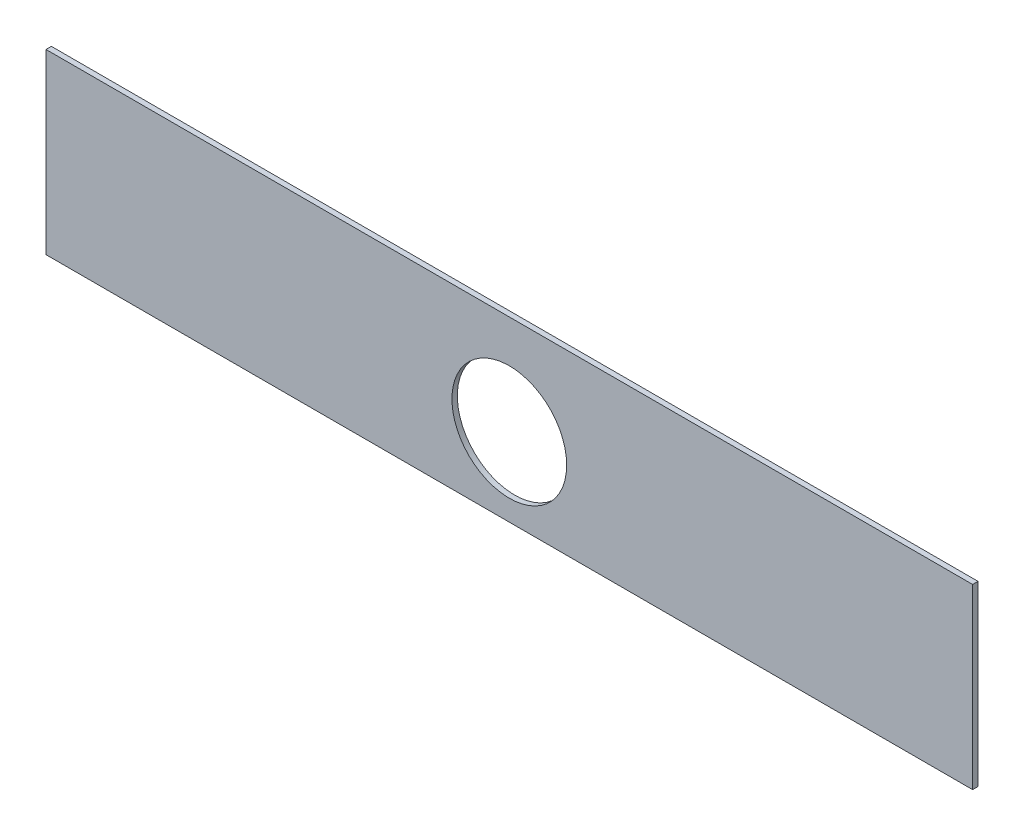
ISO-10303-21;
HEADER;
FILE_DESCRIPTION(('STEP AP214'),'2;1');
FILE_NAME('part.step','',(''),(''),'','','');
FILE_SCHEMA(('AUTOMOTIVE_DESIGN { 1 0 10303 214 1 1 1 1 }'));
ENDSEC;
DATA;
#1=APPLICATION_CONTEXT('core data for automotive mechanical design processes');
#2=APPLICATION_PROTOCOL_DEFINITION('international standard','automotive_design',2000,#1);
#3=PRODUCT_CONTEXT('',#1,'mechanical');
#4=PRODUCT('Part','Part','',(#3));
#5=PRODUCT_RELATED_PRODUCT_CATEGORY('part','',(#4));
#6=PRODUCT_DEFINITION_FORMATION('','',#4);
#7=PRODUCT_DEFINITION_CONTEXT('part definition',#1,'design');
#8=PRODUCT_DEFINITION('design','',#6,#7);
#9=PRODUCT_DEFINITION_SHAPE('','',#8);
#10=(LENGTH_UNIT() NAMED_UNIT(*) SI_UNIT(.MILLI.,.METRE.));
#11=(NAMED_UNIT(*) PLANE_ANGLE_UNIT() SI_UNIT($,.RADIAN.));
#12=(NAMED_UNIT(*) SI_UNIT($,.STERADIAN.) SOLID_ANGLE_UNIT());
#13=UNCERTAINTY_MEASURE_WITH_UNIT(LENGTH_MEASURE(1.E-05),#10,'distance_accuracy_value','');
#14=(GEOMETRIC_REPRESENTATION_CONTEXT(3) GLOBAL_UNCERTAINTY_ASSIGNED_CONTEXT((#13)) GLOBAL_UNIT_ASSIGNED_CONTEXT((#10,
#11,#12)) REPRESENTATION_CONTEXT('',''));
#15=CARTESIAN_POINT('',(0.,0.,0.));
#16=DIRECTION('',(0.,0.,1.));
#17=DIRECTION('',(1.,0.,0.));
#18=AXIS2_PLACEMENT_3D('',#15,#16,#17);
#19=CARTESIAN_POINT('',(0.,0.,1.));
#20=DIRECTION('',(0.,0.,-1.));
#21=DIRECTION('',(-1.,0.,0.));
#22=AXIS2_PLACEMENT_3D('',#19,#20,#21);
#23=PLANE('',#22);
#24=DIRECTION('',(1.,0.,0.));
#25=VECTOR('',#24,1.);
#26=CARTESIAN_POINT('',(172.05,0.,1.));
#27=LINE('',#26,#25);
#28=CARTESIAN_POINT('',(0.,0.,1.));
#29=VERTEX_POINT('',#28);
#30=CARTESIAN_POINT('',(172.05,0.,1.));
#31=VERTEX_POINT('',#30);
#32=EDGE_CURVE('E85',#29,#31,#27,.T.);
#33=ORIENTED_EDGE('',*,*,#32,.T.);
#34=DIRECTION('',(0.,1.,0.));
#35=VECTOR('',#34,1.);
#36=CARTESIAN_POINT('',(172.05,33.,1.));
#37=LINE('',#36,#35);
#38=CARTESIAN_POINT('',(172.05,33.,1.));
#39=VERTEX_POINT('',#38);
#40=EDGE_CURVE('E80',#31,#39,#37,.T.);
#41=ORIENTED_EDGE('',*,*,#40,.T.);
#42=DIRECTION('',(-1.,0.,0.));
#43=VECTOR('',#42,1.);
#44=CARTESIAN_POINT('',(0.,33.,1.));
#45=LINE('',#44,#43);
#46=CARTESIAN_POINT('',(0.,33.,1.));
#47=VERTEX_POINT('',#46);
#48=EDGE_CURVE('E83',#39,#47,#45,.T.);
#49=ORIENTED_EDGE('',*,*,#48,.T.);
#50=DIRECTION('',(0.,-1.,0.));
#51=VECTOR('',#50,1.);
#52=CARTESIAN_POINT('',(0.,0.,1.));
#53=LINE('',#52,#51);
#54=EDGE_CURVE('E50',#47,#29,#53,.T.);
#55=ORIENTED_EDGE('',*,*,#54,.T.);
#56=EDGE_LOOP('',(#33,#41,#49,#55));
#57=FACE_BOUND('',#56,.T.);
#58=CARTESIAN_POINT('',(86.025,14.5,1.));
#59=DIRECTION('',(0.,0.,1.));
#60=DIRECTION('',(1.,0.,0.));
#61=AXIS2_PLACEMENT_3D('',#58,#59,#60);
#62=CIRCLE('',#61,10.65);
#63=CARTESIAN_POINT('',(96.675,14.5,1.));
#64=VERTEX_POINT('',#63);
#65=EDGE_CURVE('E100',#64,#64,#62,.T.);
#66=ORIENTED_EDGE('',*,*,#65,.F.);
#67=EDGE_LOOP('',(#66));
#68=FACE_BOUND('',#67,.T.);
#69=ADVANCED_FACE('F33',(#57,#68),#23,.F.);
#70=CARTESIAN_POINT('',(0.,0.,0.));
#71=DIRECTION('',(0.,0.,-1.));
#72=DIRECTION('',(-1.,0.,0.));
#73=AXIS2_PLACEMENT_3D('',#70,#71,#72);
#74=PLANE('',#73);
#75=DIRECTION('',(1.,0.,0.));
#76=VECTOR('',#75,1.);
#77=CARTESIAN_POINT('',(172.05,0.,0.));
#78=LINE('',#77,#76);
#79=CARTESIAN_POINT('',(0.,0.,0.));
#80=VERTEX_POINT('',#79);
#81=CARTESIAN_POINT('',(172.05,0.,0.));
#82=VERTEX_POINT('',#81);
#83=EDGE_CURVE('E97',#80,#82,#78,.T.);
#84=ORIENTED_EDGE('',*,*,#83,.F.);
#85=DIRECTION('',(0.,-1.,0.));
#86=VECTOR('',#85,1.);
#87=CARTESIAN_POINT('',(0.,0.,0.));
#88=LINE('',#87,#86);
#89=CARTESIAN_POINT('',(0.,33.,0.));
#90=VERTEX_POINT('',#89);
#91=EDGE_CURVE('E73',#90,#80,#88,.T.);
#92=ORIENTED_EDGE('',*,*,#91,.F.);
#93=DIRECTION('',(-1.,0.,0.));
#94=VECTOR('',#93,1.);
#95=CARTESIAN_POINT('',(0.,33.,0.));
#96=LINE('',#95,#94);
#97=CARTESIAN_POINT('',(172.05,33.,0.));
#98=VERTEX_POINT('',#97);
#99=EDGE_CURVE('E67',#98,#90,#96,.T.);
#100=ORIENTED_EDGE('',*,*,#99,.F.);
#101=DIRECTION('',(0.,1.,0.));
#102=VECTOR('',#101,1.);
#103=CARTESIAN_POINT('',(172.05,33.,0.));
#104=LINE('',#103,#102);
#105=EDGE_CURVE('E89',#82,#98,#104,.T.);
#106=ORIENTED_EDGE('',*,*,#105,.F.);
#107=EDGE_LOOP('',(#84,#92,#100,#106));
#108=FACE_BOUND('',#107,.T.);
#109=CARTESIAN_POINT('',(86.025,14.5,0.));
#110=DIRECTION('',(0.,0.,1.));
#111=DIRECTION('',(1.,0.,0.));
#112=AXIS2_PLACEMENT_3D('',#109,#110,#111);
#113=CIRCLE('',#112,10.65);
#114=CARTESIAN_POINT('',(96.675,14.5,0.));
#115=VERTEX_POINT('',#114);
#116=EDGE_CURVE('E112',#115,#115,#113,.T.);
#117=ORIENTED_EDGE('',*,*,#116,.T.);
#118=EDGE_LOOP('',(#117));
#119=FACE_BOUND('',#118,.T.);
#120=ADVANCED_FACE('F108',(#108,#119),#74,.T.);
#121=CARTESIAN_POINT('',(172.05,0.,1.));
#122=DIRECTION('',(0.,1.,0.));
#123=DIRECTION('',(-1.,0.,0.));
#124=AXIS2_PLACEMENT_3D('',#121,#122,#123);
#125=PLANE('',#124);
#126=ORIENTED_EDGE('',*,*,#83,.T.);
#127=DIRECTION('',(0.,0.,-1.));
#128=VECTOR('',#127,1.);
#129=CARTESIAN_POINT('',(172.05,0.,1.));
#130=LINE('',#129,#128);
#131=EDGE_CURVE('E11',#31,#82,#130,.T.);
#132=ORIENTED_EDGE('',*,*,#131,.F.);
#133=ORIENTED_EDGE('',*,*,#32,.F.);
#134=DIRECTION('',(0.,0.,-1.));
#135=VECTOR('',#134,1.);
#136=CARTESIAN_POINT('',(0.,0.,1.));
#137=LINE('',#136,#135);
#138=EDGE_CURVE('E93',#29,#80,#137,.T.);
#139=ORIENTED_EDGE('',*,*,#138,.T.);
#140=EDGE_LOOP('',(#126,#132,#133,#139));
#141=FACE_BOUND('',#140,.T.);
#142=ADVANCED_FACE('F35',(#141),#125,.F.);
#143=CARTESIAN_POINT('',(172.05,33.,1.));
#144=DIRECTION('',(-1.,0.,0.));
#145=DIRECTION('',(0.,0.,1.));
#146=AXIS2_PLACEMENT_3D('',#143,#144,#145);
#147=PLANE('',#146);
#148=ORIENTED_EDGE('',*,*,#105,.T.);
#149=DIRECTION('',(0.,0.,-1.));
#150=VECTOR('',#149,1.);
#151=CARTESIAN_POINT('',(172.05,33.,1.));
#152=LINE('',#151,#150);
#153=EDGE_CURVE('E42',#39,#98,#152,.T.);
#154=ORIENTED_EDGE('',*,*,#153,.F.);
#155=ORIENTED_EDGE('',*,*,#40,.F.);
#156=ORIENTED_EDGE('',*,*,#131,.T.);
#157=EDGE_LOOP('',(#148,#154,#155,#156));
#158=FACE_BOUND('',#157,.T.);
#159=ADVANCED_FACE('F88',(#158),#147,.F.);
#160=CARTESIAN_POINT('',(0.,33.,1.));
#161=DIRECTION('',(0.,-1.,0.));
#162=DIRECTION('',(0.,0.,-1.));
#163=AXIS2_PLACEMENT_3D('',#160,#161,#162);
#164=PLANE('',#163);
#165=ORIENTED_EDGE('',*,*,#99,.T.);
#166=DIRECTION('',(0.,0.,-1.));
#167=VECTOR('',#166,1.);
#168=CARTESIAN_POINT('',(0.,33.,1.));
#169=LINE('',#168,#167);
#170=EDGE_CURVE('E90',#47,#90,#169,.T.);
#171=ORIENTED_EDGE('',*,*,#170,.F.);
#172=ORIENTED_EDGE('',*,*,#48,.F.);
#173=ORIENTED_EDGE('',*,*,#153,.T.);
#174=EDGE_LOOP('',(#165,#171,#172,#173));
#175=FACE_BOUND('',#174,.T.);
#176=ADVANCED_FACE('F91',(#175),#164,.F.);
#177=CARTESIAN_POINT('',(0.,0.,1.));
#178=DIRECTION('',(1.,0.,0.));
#179=DIRECTION('',(0.,0.,-1.));
#180=AXIS2_PLACEMENT_3D('',#177,#178,#179);
#181=PLANE('',#180);
#182=ORIENTED_EDGE('',*,*,#91,.T.);
#183=ORIENTED_EDGE('',*,*,#138,.F.);
#184=ORIENTED_EDGE('',*,*,#54,.F.);
#185=ORIENTED_EDGE('',*,*,#170,.T.);
#186=EDGE_LOOP('',(#182,#183,#184,#185));
#187=FACE_BOUND('',#186,.T.);
#188=ADVANCED_FACE('F105',(#187),#181,.F.);
#189=CARTESIAN_POINT('',(86.025,14.5,1.));
#190=DIRECTION('',(0.,0.,-1.));
#191=DIRECTION('',(-1.,0.,0.));
#192=AXIS2_PLACEMENT_3D('',#189,#190,#191);
#193=CYLINDRICAL_SURFACE('',#192,10.65);
#194=ORIENTED_EDGE('',*,*,#65,.T.);
#195=EDGE_LOOP('',(#194));
#196=FACE_BOUND('',#195,.T.);
#197=ORIENTED_EDGE('',*,*,#116,.F.);
#198=EDGE_LOOP('',(#197));
#199=FACE_BOUND('',#198,.T.);
#200=ADVANCED_FACE('F118',(#196,#199),#193,.F.);
#201=CLOSED_SHELL('',(#69,#120,#142,#159,#176,#188,#200));
#202=MANIFOLD_SOLID_BREP('B2',#201);
#203=ADVANCED_BREP_SHAPE_REPRESENTATION('',(#18,#202),#14);
#204=SHAPE_DEFINITION_REPRESENTATION(#9,#203);
ENDSEC;
END-ISO-10303-21;
